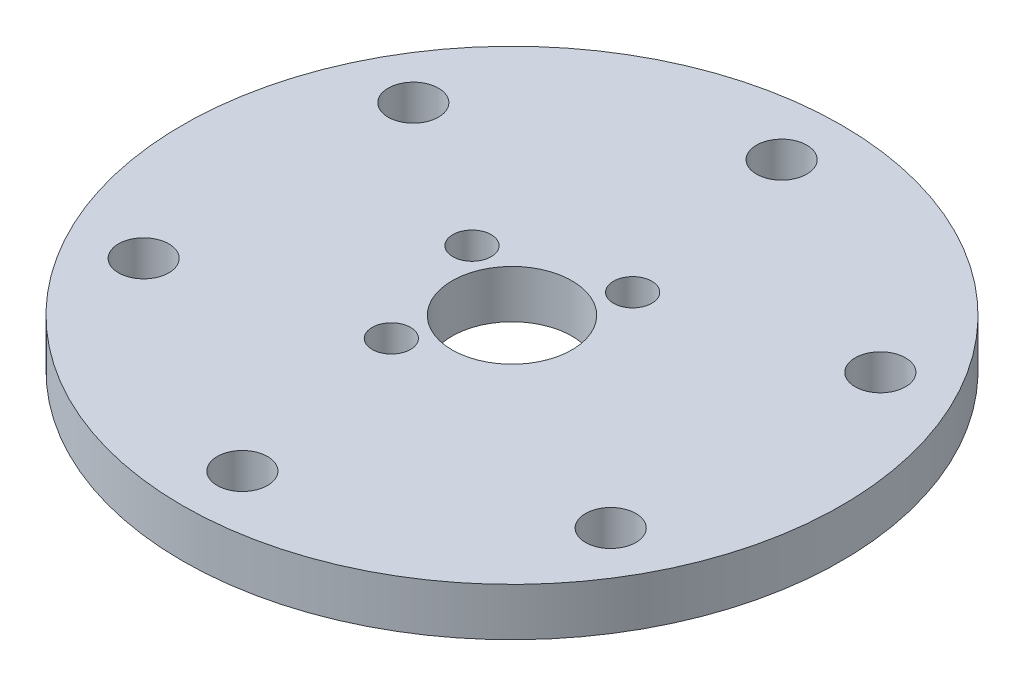
ISO-10303-21;
HEADER;
FILE_DESCRIPTION(('STEP AP214'),'2;1');
FILE_NAME('part.step','',(''),(''),'','','');
FILE_SCHEMA(('AUTOMOTIVE_DESIGN { 1 0 10303 214 1 1 1 1 }'));
ENDSEC;
DATA;
#1=APPLICATION_CONTEXT('core data for automotive mechanical design processes');
#2=APPLICATION_PROTOCOL_DEFINITION('international standard','automotive_design',2000,#1);
#3=PRODUCT_CONTEXT('',#1,'mechanical');
#4=PRODUCT('Part','Part','',(#3));
#5=PRODUCT_RELATED_PRODUCT_CATEGORY('part','',(#4));
#6=PRODUCT_DEFINITION_FORMATION('','',#4);
#7=PRODUCT_DEFINITION_CONTEXT('part definition',#1,'design');
#8=PRODUCT_DEFINITION('design','',#6,#7);
#9=PRODUCT_DEFINITION_SHAPE('','',#8);
#10=(LENGTH_UNIT() NAMED_UNIT(*) SI_UNIT(.MILLI.,.METRE.));
#11=(NAMED_UNIT(*) PLANE_ANGLE_UNIT() SI_UNIT($,.RADIAN.));
#12=(NAMED_UNIT(*) SI_UNIT($,.STERADIAN.) SOLID_ANGLE_UNIT());
#13=UNCERTAINTY_MEASURE_WITH_UNIT(LENGTH_MEASURE(1.E-05),#10,'distance_accuracy_value','');
#14=(GEOMETRIC_REPRESENTATION_CONTEXT(3) GLOBAL_UNCERTAINTY_ASSIGNED_CONTEXT((#13)) GLOBAL_UNIT_ASSIGNED_CONTEXT((#10,
#11,#12)) REPRESENTATION_CONTEXT('',''));
#15=CARTESIAN_POINT('',(0.,0.,0.));
#16=DIRECTION('',(0.,0.,1.));
#17=DIRECTION('',(1.,0.,0.));
#18=AXIS2_PLACEMENT_3D('',#15,#16,#17);
#19=CARTESIAN_POINT('',(0.,4.,0.));
#20=DIRECTION('',(0.,1.,0.));
#21=DIRECTION('',(0.,0.,1.));
#22=AXIS2_PLACEMENT_3D('',#19,#20,#21);
#23=PLANE('',#22);
#24=CARTESIAN_POINT('',(3.36569174841225,4.,-6.70239651577476));
#25=DIRECTION('',(0.,-1.,0.));
#26=DIRECTION('',(0.,0.,-1.));
#27=AXIS2_PLACEMENT_3D('',#24,#25,#26);
#28=CIRCLE('',#27,1.6);
#29=CARTESIAN_POINT('',(3.36569174841225,4.,-8.30239651577476));
#30=VERTEX_POINT('',#29);
#31=EDGE_CURVE('E109',#30,#30,#28,.T.);
#32=ORIENTED_EDGE('',*,*,#31,.T.);
#33=EDGE_LOOP('',(#32));
#34=FACE_BOUND('',#33,.T.);
#35=CARTESIAN_POINT('',(-6.70239651577476,4.,-3.36569174841225));
#36=DIRECTION('',(0.,-1.,0.));
#37=DIRECTION('',(0.,0.,-1.));
#38=AXIS2_PLACEMENT_3D('',#35,#36,#37);
#39=CIRCLE('',#38,1.6);
#40=CARTESIAN_POINT('',(-6.70239651577476,4.,-4.96569174841225));
#41=VERTEX_POINT('',#40);
#42=EDGE_CURVE('E121',#41,#41,#39,.T.);
#43=ORIENTED_EDGE('',*,*,#42,.T.);
#44=EDGE_LOOP('',(#43));
#45=FACE_BOUND('',#44,.T.);
#46=CARTESIAN_POINT('',(-3.36569174841225,4.,6.70239651577476));
#47=DIRECTION('',(0.,-1.,0.));
#48=DIRECTION('',(0.,0.,-1.));
#49=AXIS2_PLACEMENT_3D('',#46,#47,#48);
#50=CIRCLE('',#49,1.6);
#51=CARTESIAN_POINT('',(-3.36569174841225,4.,5.10239651577476));
#52=VERTEX_POINT('',#51);
#53=EDGE_CURVE('E113',#52,#52,#50,.T.);
#54=ORIENTED_EDGE('',*,*,#53,.T.);
#55=EDGE_LOOP('',(#54));
#56=FACE_BOUND('',#55,.T.);
#57=CARTESIAN_POINT('',(-19.4855715851499,4.,11.25));
#58=DIRECTION('',(0.,1.,0.));
#59=DIRECTION('',(0.,0.,1.));
#60=AXIS2_PLACEMENT_3D('',#57,#58,#59);
#61=CIRCLE('',#60,2.1);
#62=CARTESIAN_POINT('',(-19.4855715851499,4.,13.35));
#63=VERTEX_POINT('',#62);
#64=EDGE_CURVE('E93',#63,#63,#61,.T.);
#65=ORIENTED_EDGE('',*,*,#64,.F.);
#66=EDGE_LOOP('',(#65));
#67=FACE_BOUND('',#66,.T.);
#68=CARTESIAN_POINT('',(19.4855715851499,4.,11.25));
#69=DIRECTION('',(0.,1.,0.));
#70=DIRECTION('',(0.,0.,1.));
#71=AXIS2_PLACEMENT_3D('',#68,#69,#70);
#72=CIRCLE('',#71,2.1);
#73=CARTESIAN_POINT('',(19.4855715851499,4.,13.35));
#74=VERTEX_POINT('',#73);
#75=EDGE_CURVE('E77',#74,#74,#72,.T.);
#76=ORIENTED_EDGE('',*,*,#75,.F.);
#77=EDGE_LOOP('',(#76));
#78=FACE_BOUND('',#77,.T.);
#79=CARTESIAN_POINT('',(0.,4.,0.));
#80=DIRECTION('',(0.,1.,0.));
#81=DIRECTION('',(0.,0.,1.));
#82=AXIS2_PLACEMENT_3D('',#79,#80,#81);
#83=CIRCLE('',#82,5.);
#84=CARTESIAN_POINT('',(0.,4.,5.));
#85=VERTEX_POINT('',#84);
#86=EDGE_CURVE('E61',#85,#85,#83,.T.);
#87=ORIENTED_EDGE('',*,*,#86,.F.);
#88=EDGE_LOOP('',(#87));
#89=FACE_BOUND('',#88,.T.);
#90=CARTESIAN_POINT('',(0.,4.,0.));
#91=DIRECTION('',(0.,1.,0.));
#92=DIRECTION('',(0.,0.,1.));
#93=AXIS2_PLACEMENT_3D('',#90,#91,#92);
#94=CIRCLE('',#93,27.5);
#95=CARTESIAN_POINT('',(0.,4.,27.5));
#96=VERTEX_POINT('',#95);
#97=EDGE_CURVE('E10',#96,#96,#94,.T.);
#98=ORIENTED_EDGE('',*,*,#97,.T.);
#99=EDGE_LOOP('',(#98));
#100=FACE_BOUND('',#99,.T.);
#101=CARTESIAN_POINT('',(0.,4.,-22.5));
#102=DIRECTION('',(0.,1.,0.));
#103=DIRECTION('',(0.,0.,1.));
#104=AXIS2_PLACEMENT_3D('',#101,#102,#103);
#105=CIRCLE('',#104,2.1);
#106=CARTESIAN_POINT('',(0.,4.,-20.4));
#107=VERTEX_POINT('',#106);
#108=EDGE_CURVE('E55',#107,#107,#105,.T.);
#109=ORIENTED_EDGE('',*,*,#108,.F.);
#110=EDGE_LOOP('',(#109));
#111=FACE_BOUND('',#110,.T.);
#112=CARTESIAN_POINT('',(19.4855715851499,4.,-11.25));
#113=DIRECTION('',(0.,1.,0.));
#114=DIRECTION('',(0.,0.,1.));
#115=AXIS2_PLACEMENT_3D('',#112,#113,#114);
#116=CIRCLE('',#115,2.1);
#117=CARTESIAN_POINT('',(19.4855715851499,4.,-9.15));
#118=VERTEX_POINT('',#117);
#119=EDGE_CURVE('E69',#118,#118,#116,.T.);
#120=ORIENTED_EDGE('',*,*,#119,.F.);
#121=EDGE_LOOP('',(#120));
#122=FACE_BOUND('',#121,.T.);
#123=CARTESIAN_POINT('',(0.,4.,22.5));
#124=DIRECTION('',(0.,1.,0.));
#125=DIRECTION('',(0.,0.,1.));
#126=AXIS2_PLACEMENT_3D('',#123,#124,#125);
#127=CIRCLE('',#126,2.1);
#128=CARTESIAN_POINT('',(0.,4.,24.6));
#129=VERTEX_POINT('',#128);
#130=EDGE_CURVE('E85',#129,#129,#127,.T.);
#131=ORIENTED_EDGE('',*,*,#130,.F.);
#132=EDGE_LOOP('',(#131));
#133=FACE_BOUND('',#132,.T.);
#134=CARTESIAN_POINT('',(-19.4855715851499,4.,-11.25));
#135=DIRECTION('',(0.,1.,0.));
#136=DIRECTION('',(0.,0.,1.));
#137=AXIS2_PLACEMENT_3D('',#134,#135,#136);
#138=CIRCLE('',#137,2.1);
#139=CARTESIAN_POINT('',(-19.4855715851499,4.,-9.15));
#140=VERTEX_POINT('',#139);
#141=EDGE_CURVE('E101',#140,#140,#138,.T.);
#142=ORIENTED_EDGE('',*,*,#141,.F.);
#143=EDGE_LOOP('',(#142));
#144=FACE_BOUND('',#143,.T.);
#145=ADVANCED_FACE('F42',(#34,#45,#56,#67,#78,#89,#100,#111,#122,#133,#144),#23,.T.);
#146=CARTESIAN_POINT('',(0.,0.,0.));
#147=DIRECTION('',(0.,1.,0.));
#148=DIRECTION('',(0.,0.,1.));
#149=AXIS2_PLACEMENT_3D('',#146,#147,#148);
#150=PLANE('',#149);
#151=CARTESIAN_POINT('',(3.36569174841225,0.,-6.70239651577476));
#152=DIRECTION('',(0.,-1.,0.));
#153=DIRECTION('',(0.,0.,-1.));
#154=AXIS2_PLACEMENT_3D('',#151,#152,#153);
#155=CIRCLE('',#154,1.6);
#156=CARTESIAN_POINT('',(3.36569174841225,0.,-8.30239651577476));
#157=VERTEX_POINT('',#156);
#158=EDGE_CURVE('E129',#157,#157,#155,.T.);
#159=ORIENTED_EDGE('',*,*,#158,.F.);
#160=EDGE_LOOP('',(#159));
#161=FACE_BOUND('',#160,.T.);
#162=CARTESIAN_POINT('',(-6.70239651577476,0.,-3.36569174841225));
#163=DIRECTION('',(0.,-1.,0.));
#164=DIRECTION('',(0.,0.,-1.));
#165=AXIS2_PLACEMENT_3D('',#162,#163,#164);
#166=CIRCLE('',#165,1.6);
#167=CARTESIAN_POINT('',(-6.70239651577476,0.,-4.96569174841225));
#168=VERTEX_POINT('',#167);
#169=EDGE_CURVE('E125',#168,#168,#166,.T.);
#170=ORIENTED_EDGE('',*,*,#169,.F.);
#171=EDGE_LOOP('',(#170));
#172=FACE_BOUND('',#171,.T.);
#173=CARTESIAN_POINT('',(-3.36569174841225,0.,6.70239651577476));
#174=DIRECTION('',(0.,-1.,0.));
#175=DIRECTION('',(0.,0.,-1.));
#176=AXIS2_PLACEMENT_3D('',#173,#174,#175);
#177=CIRCLE('',#176,1.6);
#178=CARTESIAN_POINT('',(-3.36569174841225,0.,5.10239651577476));
#179=VERTEX_POINT('',#178);
#180=EDGE_CURVE('E117',#179,#179,#177,.T.);
#181=ORIENTED_EDGE('',*,*,#180,.F.);
#182=EDGE_LOOP('',(#181));
#183=FACE_BOUND('',#182,.T.);
#184=CARTESIAN_POINT('',(0.,0.,0.));
#185=DIRECTION('',(0.,1.,0.));
#186=DIRECTION('',(0.,0.,1.));
#187=AXIS2_PLACEMENT_3D('',#184,#185,#186);
#188=CIRCLE('',#187,27.5);
#189=CARTESIAN_POINT('',(0.,0.,27.5));
#190=VERTEX_POINT('',#189);
#191=EDGE_CURVE('E46',#190,#190,#188,.T.);
#192=ORIENTED_EDGE('',*,*,#191,.F.);
#193=EDGE_LOOP('',(#192));
#194=FACE_BOUND('',#193,.T.);
#195=CARTESIAN_POINT('',(0.,0.,-22.5));
#196=DIRECTION('',(0.,1.,0.));
#197=DIRECTION('',(0.,0.,1.));
#198=AXIS2_PLACEMENT_3D('',#195,#196,#197);
#199=CIRCLE('',#198,2.1);
#200=CARTESIAN_POINT('',(0.,0.,-20.4));
#201=VERTEX_POINT('',#200);
#202=EDGE_CURVE('E57',#201,#201,#199,.T.);
#203=ORIENTED_EDGE('',*,*,#202,.T.);
#204=EDGE_LOOP('',(#203));
#205=FACE_BOUND('',#204,.T.);
#206=CARTESIAN_POINT('',(0.,0.,0.));
#207=DIRECTION('',(0.,1.,0.));
#208=DIRECTION('',(0.,0.,1.));
#209=AXIS2_PLACEMENT_3D('',#206,#207,#208);
#210=CIRCLE('',#209,5.);
#211=CARTESIAN_POINT('',(0.,0.,5.));
#212=VERTEX_POINT('',#211);
#213=EDGE_CURVE('E65',#212,#212,#210,.T.);
#214=ORIENTED_EDGE('',*,*,#213,.T.);
#215=EDGE_LOOP('',(#214));
#216=FACE_BOUND('',#215,.T.);
#217=CARTESIAN_POINT('',(19.4855715851499,0.,-11.25));
#218=DIRECTION('',(0.,1.,0.));
#219=DIRECTION('',(0.,0.,1.));
#220=AXIS2_PLACEMENT_3D('',#217,#218,#219);
#221=CIRCLE('',#220,2.1);
#222=CARTESIAN_POINT('',(19.4855715851499,0.,-9.15));
#223=VERTEX_POINT('',#222);
#224=EDGE_CURVE('E73',#223,#223,#221,.T.);
#225=ORIENTED_EDGE('',*,*,#224,.T.);
#226=EDGE_LOOP('',(#225));
#227=FACE_BOUND('',#226,.T.);
#228=CARTESIAN_POINT('',(19.4855715851499,0.,11.25));
#229=DIRECTION('',(0.,1.,0.));
#230=DIRECTION('',(0.,0.,1.));
#231=AXIS2_PLACEMENT_3D('',#228,#229,#230);
#232=CIRCLE('',#231,2.1);
#233=CARTESIAN_POINT('',(19.4855715851499,0.,13.35));
#234=VERTEX_POINT('',#233);
#235=EDGE_CURVE('E81',#234,#234,#232,.T.);
#236=ORIENTED_EDGE('',*,*,#235,.T.);
#237=EDGE_LOOP('',(#236));
#238=FACE_BOUND('',#237,.T.);
#239=CARTESIAN_POINT('',(0.,0.,22.5));
#240=DIRECTION('',(0.,1.,0.));
#241=DIRECTION('',(0.,0.,1.));
#242=AXIS2_PLACEMENT_3D('',#239,#240,#241);
#243=CIRCLE('',#242,2.1);
#244=CARTESIAN_POINT('',(0.,0.,24.6));
#245=VERTEX_POINT('',#244);
#246=EDGE_CURVE('E89',#245,#245,#243,.T.);
#247=ORIENTED_EDGE('',*,*,#246,.T.);
#248=EDGE_LOOP('',(#247));
#249=FACE_BOUND('',#248,.T.);
#250=CARTESIAN_POINT('',(-19.4855715851499,0.,11.25));
#251=DIRECTION('',(0.,1.,0.));
#252=DIRECTION('',(0.,0.,1.));
#253=AXIS2_PLACEMENT_3D('',#250,#251,#252);
#254=CIRCLE('',#253,2.1);
#255=CARTESIAN_POINT('',(-19.4855715851499,0.,13.35));
#256=VERTEX_POINT('',#255);
#257=EDGE_CURVE('E97',#256,#256,#254,.T.);
#258=ORIENTED_EDGE('',*,*,#257,.T.);
#259=EDGE_LOOP('',(#258));
#260=FACE_BOUND('',#259,.T.);
#261=CARTESIAN_POINT('',(-19.4855715851499,0.,-11.25));
#262=DIRECTION('',(0.,1.,0.));
#263=DIRECTION('',(0.,0.,1.));
#264=AXIS2_PLACEMENT_3D('',#261,#262,#263);
#265=CIRCLE('',#264,2.1);
#266=CARTESIAN_POINT('',(-19.4855715851499,0.,-9.15));
#267=VERTEX_POINT('',#266);
#268=EDGE_CURVE('E105',#267,#267,#265,.T.);
#269=ORIENTED_EDGE('',*,*,#268,.T.);
#270=EDGE_LOOP('',(#269));
#271=FACE_BOUND('',#270,.T.);
#272=ADVANCED_FACE('F146',(#161,#172,#183,#194,#205,#216,#227,#238,#249,#260,#271),#150,.F.);
#273=CARTESIAN_POINT('',(0.,4.,0.));
#274=DIRECTION('',(0.,-1.,0.));
#275=DIRECTION('',(0.,0.,-1.));
#276=AXIS2_PLACEMENT_3D('',#273,#274,#275);
#277=CYLINDRICAL_SURFACE('',#276,27.5);
#278=ORIENTED_EDGE('',*,*,#97,.F.);
#279=EDGE_LOOP('',(#278));
#280=FACE_BOUND('',#279,.T.);
#281=ORIENTED_EDGE('',*,*,#191,.T.);
#282=EDGE_LOOP('',(#281));
#283=FACE_BOUND('',#282,.T.);
#284=ADVANCED_FACE('F44',(#280,#283),#277,.T.);
#285=CARTESIAN_POINT('',(0.,4.,-22.5));
#286=DIRECTION('',(0.,-1.,0.));
#287=DIRECTION('',(0.,0.,-1.));
#288=AXIS2_PLACEMENT_3D('',#285,#286,#287);
#289=CYLINDRICAL_SURFACE('',#288,2.1);
#290=ORIENTED_EDGE('',*,*,#108,.T.);
#291=EDGE_LOOP('',(#290));
#292=FACE_BOUND('',#291,.T.);
#293=ORIENTED_EDGE('',*,*,#202,.F.);
#294=EDGE_LOOP('',(#293));
#295=FACE_BOUND('',#294,.T.);
#296=ADVANCED_FACE('F189',(#292,#295),#289,.F.);
#297=CARTESIAN_POINT('',(0.,4.,0.));
#298=DIRECTION('',(0.,-1.,0.));
#299=DIRECTION('',(0.,0.,-1.));
#300=AXIS2_PLACEMENT_3D('',#297,#298,#299);
#301=CYLINDRICAL_SURFACE('',#300,5.);
#302=ORIENTED_EDGE('',*,*,#86,.T.);
#303=EDGE_LOOP('',(#302));
#304=FACE_BOUND('',#303,.T.);
#305=ORIENTED_EDGE('',*,*,#213,.F.);
#306=EDGE_LOOP('',(#305));
#307=FACE_BOUND('',#306,.T.);
#308=ADVANCED_FACE('F192',(#304,#307),#301,.F.);
#309=CARTESIAN_POINT('',(19.4855715851499,4.,-11.25));
#310=DIRECTION('',(0.,-1.,0.));
#311=DIRECTION('',(0.,0.,-1.));
#312=AXIS2_PLACEMENT_3D('',#309,#310,#311);
#313=CYLINDRICAL_SURFACE('',#312,2.1);
#314=ORIENTED_EDGE('',*,*,#119,.T.);
#315=EDGE_LOOP('',(#314));
#316=FACE_BOUND('',#315,.T.);
#317=ORIENTED_EDGE('',*,*,#224,.F.);
#318=EDGE_LOOP('',(#317));
#319=FACE_BOUND('',#318,.T.);
#320=ADVANCED_FACE('F196',(#316,#319),#313,.F.);
#321=CARTESIAN_POINT('',(19.4855715851499,4.,11.25));
#322=DIRECTION('',(0.,-1.,0.));
#323=DIRECTION('',(0.,0.,-1.));
#324=AXIS2_PLACEMENT_3D('',#321,#322,#323);
#325=CYLINDRICAL_SURFACE('',#324,2.1);
#326=ORIENTED_EDGE('',*,*,#75,.T.);
#327=EDGE_LOOP('',(#326));
#328=FACE_BOUND('',#327,.T.);
#329=ORIENTED_EDGE('',*,*,#235,.F.);
#330=EDGE_LOOP('',(#329));
#331=FACE_BOUND('',#330,.T.);
#332=ADVANCED_FACE('F200',(#328,#331),#325,.F.);
#333=CARTESIAN_POINT('',(0.,4.,22.5));
#334=DIRECTION('',(0.,-1.,0.));
#335=DIRECTION('',(0.,0.,-1.));
#336=AXIS2_PLACEMENT_3D('',#333,#334,#335);
#337=CYLINDRICAL_SURFACE('',#336,2.1);
#338=ORIENTED_EDGE('',*,*,#130,.T.);
#339=EDGE_LOOP('',(#338));
#340=FACE_BOUND('',#339,.T.);
#341=ORIENTED_EDGE('',*,*,#246,.F.);
#342=EDGE_LOOP('',(#341));
#343=FACE_BOUND('',#342,.T.);
#344=ADVANCED_FACE('F182',(#340,#343),#337,.F.);
#345=CARTESIAN_POINT('',(-19.4855715851499,4.,11.25));
#346=DIRECTION('',(0.,-1.,0.));
#347=DIRECTION('',(0.,0.,-1.));
#348=AXIS2_PLACEMENT_3D('',#345,#346,#347);
#349=CYLINDRICAL_SURFACE('',#348,2.1);
#350=ORIENTED_EDGE('',*,*,#64,.T.);
#351=EDGE_LOOP('',(#350));
#352=FACE_BOUND('',#351,.T.);
#353=ORIENTED_EDGE('',*,*,#257,.F.);
#354=EDGE_LOOP('',(#353));
#355=FACE_BOUND('',#354,.T.);
#356=ADVANCED_FACE('F172',(#352,#355),#349,.F.);
#357=CARTESIAN_POINT('',(-19.4855715851499,4.,-11.25));
#358=DIRECTION('',(0.,-1.,0.));
#359=DIRECTION('',(0.,0.,-1.));
#360=AXIS2_PLACEMENT_3D('',#357,#358,#359);
#361=CYLINDRICAL_SURFACE('',#360,2.1);
#362=ORIENTED_EDGE('',*,*,#141,.T.);
#363=EDGE_LOOP('',(#362));
#364=FACE_BOUND('',#363,.T.);
#365=ORIENTED_EDGE('',*,*,#268,.F.);
#366=EDGE_LOOP('',(#365));
#367=FACE_BOUND('',#366,.T.);
#368=ADVANCED_FACE('F169',(#364,#367),#361,.F.);
#369=CARTESIAN_POINT('',(-3.36569174841225,4.,6.70239651577476));
#370=DIRECTION('',(0.,-1.,0.));
#371=DIRECTION('',(0.,0.,-1.));
#372=AXIS2_PLACEMENT_3D('',#369,#370,#371);
#373=CYLINDRICAL_SURFACE('',#372,1.6);
#374=ORIENTED_EDGE('',*,*,#53,.F.);
#375=EDGE_LOOP('',(#374));
#376=FACE_BOUND('',#375,.T.);
#377=ORIENTED_EDGE('',*,*,#180,.T.);
#378=EDGE_LOOP('',(#377));
#379=FACE_BOUND('',#378,.T.);
#380=ADVANCED_FACE('F171',(#376,#379),#373,.F.);
#381=CARTESIAN_POINT('',(-6.70239651577476,4.,-3.36569174841225));
#382=DIRECTION('',(0.,-1.,0.));
#383=DIRECTION('',(0.,0.,-1.));
#384=AXIS2_PLACEMENT_3D('',#381,#382,#383);
#385=CYLINDRICAL_SURFACE('',#384,1.6);
#386=ORIENTED_EDGE('',*,*,#42,.F.);
#387=EDGE_LOOP('',(#386));
#388=FACE_BOUND('',#387,.T.);
#389=ORIENTED_EDGE('',*,*,#169,.T.);
#390=EDGE_LOOP('',(#389));
#391=FACE_BOUND('',#390,.T.);
#392=ADVANCED_FACE('F142',(#388,#391),#385,.F.);
#393=CARTESIAN_POINT('',(3.36569174841225,4.,-6.70239651577476));
#394=DIRECTION('',(0.,-1.,0.));
#395=DIRECTION('',(0.,0.,-1.));
#396=AXIS2_PLACEMENT_3D('',#393,#394,#395);
#397=CYLINDRICAL_SURFACE('',#396,1.6);
#398=ORIENTED_EDGE('',*,*,#31,.F.);
#399=EDGE_LOOP('',(#398));
#400=FACE_BOUND('',#399,.T.);
#401=ORIENTED_EDGE('',*,*,#158,.T.);
#402=EDGE_LOOP('',(#401));
#403=FACE_BOUND('',#402,.T.);
#404=ADVANCED_FACE('F139',(#400,#403),#397,.F.);
#405=CLOSED_SHELL('',(#145,#272,#284,#296,#308,#320,#332,#344,#356,#368,#380,#392,#404));
#406=MANIFOLD_SOLID_BREP('B2',#405);
#407=ADVANCED_BREP_SHAPE_REPRESENTATION('',(#18,#406),#14);
#408=SHAPE_DEFINITION_REPRESENTATION(#9,#407);
ENDSEC;
END-ISO-10303-21;
